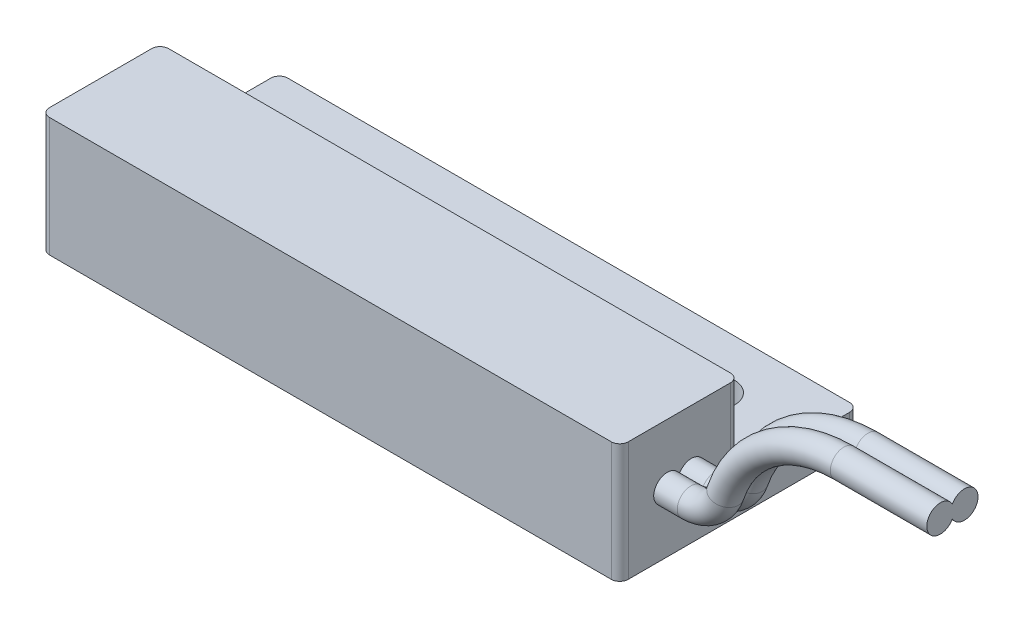
ISO-10303-21;
HEADER;
FILE_DESCRIPTION(('STEP AP214'),'2;1');
FILE_NAME('part.step','',(''),(''),'','','');
FILE_SCHEMA(('AUTOMOTIVE_DESIGN { 1 0 10303 214 1 1 1 1 }'));
ENDSEC;
DATA;
#1=APPLICATION_CONTEXT('core data for automotive mechanical design processes');
#2=APPLICATION_PROTOCOL_DEFINITION('international standard','automotive_design',2000,#1);
#3=PRODUCT_CONTEXT('',#1,'mechanical');
#4=PRODUCT('Part','Part','',(#3));
#5=PRODUCT_RELATED_PRODUCT_CATEGORY('part','',(#4));
#6=PRODUCT_DEFINITION_FORMATION('','',#4);
#7=PRODUCT_DEFINITION_CONTEXT('part definition',#1,'design');
#8=PRODUCT_DEFINITION('design','',#6,#7);
#9=PRODUCT_DEFINITION_SHAPE('','',#8);
#10=(LENGTH_UNIT() NAMED_UNIT(*) SI_UNIT(.MILLI.,.METRE.));
#11=(NAMED_UNIT(*) PLANE_ANGLE_UNIT() SI_UNIT($,.RADIAN.));
#12=(NAMED_UNIT(*) SI_UNIT($,.STERADIAN.) SOLID_ANGLE_UNIT());
#13=UNCERTAINTY_MEASURE_WITH_UNIT(LENGTH_MEASURE(1.E-05),#10,'distance_accuracy_value','');
#14=(GEOMETRIC_REPRESENTATION_CONTEXT(3) GLOBAL_UNCERTAINTY_ASSIGNED_CONTEXT((#13)) GLOBAL_UNIT_ASSIGNED_CONTEXT((#10,
#11,#12)) REPRESENTATION_CONTEXT('',''));
#15=CARTESIAN_POINT('',(0.,0.,0.));
#16=DIRECTION('',(0.,0.,1.));
#17=DIRECTION('',(1.,0.,0.));
#18=AXIS2_PLACEMENT_3D('',#15,#16,#17);
#19=CARTESIAN_POINT('',(17.,2.,-7.));
#20=DIRECTION('',(-1.,0.,0.));
#21=DIRECTION('',(0.,0.,1.));
#22=AXIS2_PLACEMENT_3D('',#19,#20,#21);
#23=PLANE('',#22);
#24=CARTESIAN_POINT('',(17.,3.5,4.20673758696571));
#25=DIRECTION('',(1.,0.,0.));
#26=DIRECTION('',(0.,0.,-1.));
#27=AXIS2_PLACEMENT_3D('',#24,#25,#26);
#28=CIRCLE('',#27,0.8);
#29=CARTESIAN_POINT('',(17.,3.87486261906181,3.5));
#30=VERTEX_POINT('',#29);
#31=CARTESIAN_POINT('',(17.,3.12513738093819,3.5));
#32=VERTEX_POINT('',#31);
#33=EDGE_CURVE('E156',#30,#32,#28,.T.);
#34=ORIENTED_EDGE('',*,*,#33,.F.);
#35=CARTESIAN_POINT('',(17.,3.5,2.79326241303428));
#36=DIRECTION('',(1.,0.,0.));
#37=DIRECTION('',(0.,0.,-1.));
#38=AXIS2_PLACEMENT_3D('',#35,#36,#37);
#39=CIRCLE('',#38,0.8);
#40=EDGE_CURVE('E162',#32,#30,#39,.T.);
#41=ORIENTED_EDGE('',*,*,#40,.F.);
#42=EDGE_LOOP('',(#34,#41));
#43=FACE_BOUND('',#42,.T.);
#44=DIRECTION('',(0.,0.,-1.));
#45=VECTOR('',#44,1.);
#46=CARTESIAN_POINT('',(17.,2.,-7.));
#47=LINE('',#46,#45);
#48=CARTESIAN_POINT('',(17.,2.,0.499999999999999));
#49=VERTEX_POINT('',#48);
#50=CARTESIAN_POINT('',(17.,2.,-6.5));
#51=VERTEX_POINT('',#50);
#52=EDGE_CURVE('E240',#49,#51,#47,.T.);
#53=ORIENTED_EDGE('',*,*,#52,.F.);
#54=DIRECTION('',(0.,-1.,0.));
#55=VECTOR('',#54,1.);
#56=CARTESIAN_POINT('',(17.,2.,0.499999999999999));
#57=LINE('',#56,#55);
#58=CARTESIAN_POINT('',(17.,7.,0.499999999999999));
#59=VERTEX_POINT('',#58);
#60=EDGE_CURVE('E267',#49,#59,#57,.F.);
#61=ORIENTED_EDGE('',*,*,#60,.T.);
#62=DIRECTION('',(0.,0.,-1.));
#63=VECTOR('',#62,1.);
#64=CARTESIAN_POINT('',(17.,7.,7.));
#65=LINE('',#64,#63);
#66=CARTESIAN_POINT('',(17.,7.,6.5));
#67=VERTEX_POINT('',#66);
#68=EDGE_CURVE('E225',#67,#59,#65,.T.);
#69=ORIENTED_EDGE('',*,*,#68,.F.);
#70=DIRECTION('',(0.,-1.,0.));
#71=VECTOR('',#70,1.);
#72=CARTESIAN_POINT('',(17.,2.,6.5));
#73=LINE('',#72,#71);
#74=CARTESIAN_POINT('',(17.,0.,6.5));
#75=VERTEX_POINT('',#74);
#76=EDGE_CURVE('E262',#67,#75,#73,.T.);
#77=ORIENTED_EDGE('',*,*,#76,.T.);
#78=DIRECTION('',(0.,0.,-1.));
#79=VECTOR('',#78,1.);
#80=CARTESIAN_POINT('',(17.,0.,-7.));
#81=LINE('',#80,#79);
#82=CARTESIAN_POINT('',(17.,0.,-6.5));
#83=VERTEX_POINT('',#82);
#84=EDGE_CURVE('E237',#75,#83,#81,.T.);
#85=ORIENTED_EDGE('',*,*,#84,.T.);
#86=DIRECTION('',(0.,-1.,0.));
#87=VECTOR('',#86,1.);
#88=CARTESIAN_POINT('',(17.,2.,-6.5));
#89=LINE('',#88,#87);
#90=EDGE_CURVE('E265',#83,#51,#89,.F.);
#91=ORIENTED_EDGE('',*,*,#90,.T.);
#92=EDGE_LOOP('',(#53,#61,#69,#77,#85,#91));
#93=FACE_BOUND('',#92,.T.);
#94=ADVANCED_FACE('F36',(#43,#93),#23,.F.);
#95=CARTESIAN_POINT('',(-17.,2.,-7.));
#96=DIRECTION('',(0.,0.,1.));
#97=DIRECTION('',(1.,0.,0.));
#98=AXIS2_PLACEMENT_3D('',#95,#96,#97);
#99=PLANE('',#98);
#100=DIRECTION('',(-1.,0.,0.));
#101=VECTOR('',#100,1.);
#102=CARTESIAN_POINT('',(-17.,0.,-7.));
#103=LINE('',#102,#101);
#104=CARTESIAN_POINT('',(16.5,0.,-7.));
#105=VERTEX_POINT('',#104);
#106=CARTESIAN_POINT('',(-16.5,0.,-7.));
#107=VERTEX_POINT('',#106);
#108=EDGE_CURVE('E251',#105,#107,#103,.T.);
#109=ORIENTED_EDGE('',*,*,#108,.T.);
#110=DIRECTION('',(0.,-1.,0.));
#111=VECTOR('',#110,1.);
#112=CARTESIAN_POINT('',(-16.5,2.,-7.));
#113=LINE('',#112,#111);
#114=CARTESIAN_POINT('',(-16.5,2.,-7.));
#115=VERTEX_POINT('',#114);
#116=EDGE_CURVE('E59',#107,#115,#113,.F.);
#117=ORIENTED_EDGE('',*,*,#116,.T.);
#118=DIRECTION('',(-1.,0.,0.));
#119=VECTOR('',#118,1.);
#120=CARTESIAN_POINT('',(-17.,2.,-7.));
#121=LINE('',#120,#119);
#122=CARTESIAN_POINT('',(16.5,2.,-7.));
#123=VERTEX_POINT('',#122);
#124=EDGE_CURVE('E243',#123,#115,#121,.T.);
#125=ORIENTED_EDGE('',*,*,#124,.F.);
#126=DIRECTION('',(0.,-1.,0.));
#127=VECTOR('',#126,1.);
#128=CARTESIAN_POINT('',(16.5,2.,-7.));
#129=LINE('',#128,#127);
#130=EDGE_CURVE('E298',#123,#105,#129,.T.);
#131=ORIENTED_EDGE('',*,*,#130,.T.);
#132=EDGE_LOOP('',(#109,#117,#125,#131));
#133=FACE_BOUND('',#132,.T.);
#134=ADVANCED_FACE('F333',(#133),#99,.F.);
#135=CARTESIAN_POINT('',(-17.,2.,-7.));
#136=DIRECTION('',(1.,0.,0.));
#137=DIRECTION('',(0.,0.,-1.));
#138=AXIS2_PLACEMENT_3D('',#135,#136,#137);
#139=PLANE('',#138);
#140=DIRECTION('',(0.,0.,1.));
#141=VECTOR('',#140,1.);
#142=CARTESIAN_POINT('',(-17.,7.,7.));
#143=LINE('',#142,#141);
#144=CARTESIAN_POINT('',(-17.,7.,0.499999999999999));
#145=VERTEX_POINT('',#144);
#146=CARTESIAN_POINT('',(-17.,7.,6.5));
#147=VERTEX_POINT('',#146);
#148=EDGE_CURVE('E231',#145,#147,#143,.T.);
#149=ORIENTED_EDGE('',*,*,#148,.F.);
#150=DIRECTION('',(0.,-1.,0.));
#151=VECTOR('',#150,1.);
#152=CARTESIAN_POINT('',(-17.,2.,0.499999999999999));
#153=LINE('',#152,#151);
#154=CARTESIAN_POINT('',(-17.,2.,0.499999999999999));
#155=VERTEX_POINT('',#154);
#156=EDGE_CURVE('E282',#145,#155,#153,.T.);
#157=ORIENTED_EDGE('',*,*,#156,.T.);
#158=DIRECTION('',(0.,0.,1.));
#159=VECTOR('',#158,1.);
#160=CARTESIAN_POINT('',(-17.,2.,-7.));
#161=LINE('',#160,#159);
#162=CARTESIAN_POINT('',(-17.,2.,-6.5));
#163=VERTEX_POINT('',#162);
#164=EDGE_CURVE('E246',#163,#155,#161,.T.);
#165=ORIENTED_EDGE('',*,*,#164,.F.);
#166=DIRECTION('',(0.,-1.,0.));
#167=VECTOR('',#166,1.);
#168=CARTESIAN_POINT('',(-17.,2.,-6.5));
#169=LINE('',#168,#167);
#170=CARTESIAN_POINT('',(-17.,0.,-6.5));
#171=VERTEX_POINT('',#170);
#172=EDGE_CURVE('E277',#163,#171,#169,.T.);
#173=ORIENTED_EDGE('',*,*,#172,.T.);
#174=DIRECTION('',(0.,0.,1.));
#175=VECTOR('',#174,1.);
#176=CARTESIAN_POINT('',(-17.,0.,-7.));
#177=LINE('',#176,#175);
#178=CARTESIAN_POINT('',(-17.,0.,6.5));
#179=VERTEX_POINT('',#178);
#180=EDGE_CURVE('E253',#171,#179,#177,.T.);
#181=ORIENTED_EDGE('',*,*,#180,.T.);
#182=DIRECTION('',(0.,-1.,0.));
#183=VECTOR('',#182,1.);
#184=CARTESIAN_POINT('',(-17.,2.,6.5));
#185=LINE('',#184,#183);
#186=EDGE_CURVE('E280',#179,#147,#185,.F.);
#187=ORIENTED_EDGE('',*,*,#186,.T.);
#188=EDGE_LOOP('',(#149,#157,#165,#173,#181,#187));
#189=FACE_BOUND('',#188,.T.);
#190=ADVANCED_FACE('F342',(#189),#139,.F.);
#191=CARTESIAN_POINT('',(-17.,2.,7.));
#192=DIRECTION('',(0.,0.,-1.));
#193=DIRECTION('',(-1.,0.,0.));
#194=AXIS2_PLACEMENT_3D('',#191,#192,#193);
#195=PLANE('',#194);
#196=DIRECTION('',(1.,0.,0.));
#197=VECTOR('',#196,1.);
#198=CARTESIAN_POINT('',(17.,7.,7.));
#199=LINE('',#198,#197);
#200=CARTESIAN_POINT('',(-16.5,7.,7.));
#201=VERTEX_POINT('',#200);
#202=CARTESIAN_POINT('',(16.5,7.,7.));
#203=VERTEX_POINT('',#202);
#204=EDGE_CURVE('E234',#201,#203,#199,.T.);
#205=ORIENTED_EDGE('',*,*,#204,.F.);
#206=DIRECTION('',(0.,-1.,0.));
#207=VECTOR('',#206,1.);
#208=CARTESIAN_POINT('',(-16.5,2.,7.));
#209=LINE('',#208,#207);
#210=CARTESIAN_POINT('',(-16.5,0.,7.));
#211=VERTEX_POINT('',#210);
#212=EDGE_CURVE('E287',#201,#211,#209,.T.);
#213=ORIENTED_EDGE('',*,*,#212,.T.);
#214=DIRECTION('',(1.,0.,0.));
#215=VECTOR('',#214,1.);
#216=CARTESIAN_POINT('',(-17.,0.,7.));
#217=LINE('',#216,#215);
#218=CARTESIAN_POINT('',(16.5,0.,7.));
#219=VERTEX_POINT('',#218);
#220=EDGE_CURVE('E244',#211,#219,#217,.T.);
#221=ORIENTED_EDGE('',*,*,#220,.T.);
#222=DIRECTION('',(0.,-1.,0.));
#223=VECTOR('',#222,1.);
#224=CARTESIAN_POINT('',(16.5,2.,7.));
#225=LINE('',#224,#223);
#226=EDGE_CURVE('E285',#219,#203,#225,.F.);
#227=ORIENTED_EDGE('',*,*,#226,.T.);
#228=EDGE_LOOP('',(#205,#213,#221,#227));
#229=FACE_BOUND('',#228,.T.);
#230=ADVANCED_FACE('F349',(#229),#195,.F.);
#231=CARTESIAN_POINT('',(0.,2.,0.));
#232=DIRECTION('',(0.,1.,0.));
#233=DIRECTION('',(0.,0.,1.));
#234=AXIS2_PLACEMENT_3D('',#231,#232,#233);
#235=PLANE('',#234);
#236=CARTESIAN_POINT('',(12.,2.,-3.5));
#237=DIRECTION('',(0.,1.,0.));
#238=DIRECTION('',(0.,0.,1.));
#239=AXIS2_PLACEMENT_3D('',#236,#237,#238);
#240=CIRCLE('',#239,1.25);
#241=CARTESIAN_POINT('',(12.,2.,-2.25));
#242=VERTEX_POINT('',#241);
#243=EDGE_CURVE('E213',#242,#242,#240,.T.);
#244=ORIENTED_EDGE('',*,*,#243,.F.);
#245=EDGE_LOOP('',(#244));
#246=FACE_BOUND('',#245,.T.);
#247=CARTESIAN_POINT('',(-12.,2.,-3.5));
#248=DIRECTION('',(0.,1.,0.));
#249=DIRECTION('',(0.,0.,-1.));
#250=AXIS2_PLACEMENT_3D('',#247,#248,#249);
#251=CIRCLE('',#250,1.25);
#252=CARTESIAN_POINT('',(-12.,2.,-4.75));
#253=VERTEX_POINT('',#252);
#254=EDGE_CURVE('E212',#253,#253,#251,.T.);
#255=ORIENTED_EDGE('',*,*,#254,.F.);
#256=EDGE_LOOP('',(#255));
#257=FACE_BOUND('',#256,.T.);
#258=ORIENTED_EDGE('',*,*,#124,.T.);
#259=CARTESIAN_POINT('',(-16.5,2.,-6.5));
#260=DIRECTION('',(0.,1.,0.));
#261=DIRECTION('',(0.,0.,1.));
#262=AXIS2_PLACEMENT_3D('',#259,#260,#261);
#263=CIRCLE('',#262,0.5);
#264=EDGE_CURVE('E304',#115,#163,#263,.T.);
#265=ORIENTED_EDGE('',*,*,#264,.T.);
#266=ORIENTED_EDGE('',*,*,#164,.T.);
#267=CARTESIAN_POINT('',(-16.5,2.,0.499999999999999));
#268=DIRECTION('',(0.,1.,0.));
#269=DIRECTION('',(0.,0.,1.));
#270=AXIS2_PLACEMENT_3D('',#267,#268,#269);
#271=CIRCLE('',#270,0.5);
#272=CARTESIAN_POINT('',(-16.5,2.,0.));
#273=VERTEX_POINT('',#272);
#274=EDGE_CURVE('E11',#155,#273,#271,.F.);
#275=ORIENTED_EDGE('',*,*,#274,.T.);
#276=DIRECTION('',(-1.,0.,0.));
#277=VECTOR('',#276,1.);
#278=CARTESIAN_POINT('',(17.,2.,0.));
#279=LINE('',#278,#277);
#280=CARTESIAN_POINT('',(16.5,2.,0.));
#281=VERTEX_POINT('',#280);
#282=EDGE_CURVE('E220',#281,#273,#279,.T.);
#283=ORIENTED_EDGE('',*,*,#282,.F.);
#284=CARTESIAN_POINT('',(16.5,2.,0.499999999999999));
#285=DIRECTION('',(0.,1.,0.));
#286=DIRECTION('',(0.,0.,1.));
#287=AXIS2_PLACEMENT_3D('',#284,#285,#286);
#288=CIRCLE('',#287,0.5);
#289=EDGE_CURVE('E44',#281,#49,#288,.F.);
#290=ORIENTED_EDGE('',*,*,#289,.T.);
#291=ORIENTED_EDGE('',*,*,#52,.T.);
#292=CARTESIAN_POINT('',(16.5,2.,-6.5));
#293=DIRECTION('',(0.,1.,0.));
#294=DIRECTION('',(0.,0.,1.));
#295=AXIS2_PLACEMENT_3D('',#292,#293,#294);
#296=CIRCLE('',#295,0.5);
#297=EDGE_CURVE('E302',#51,#123,#296,.T.);
#298=ORIENTED_EDGE('',*,*,#297,.T.);
#299=EDGE_LOOP('',(#258,#265,#266,#275,#283,#290,#291,#298));
#300=FACE_BOUND('',#299,.T.);
#301=ADVANCED_FACE('F309',(#246,#257,#300),#235,.T.);
#302=CARTESIAN_POINT('',(0.,0.,0.));
#303=DIRECTION('',(0.,1.,0.));
#304=DIRECTION('',(0.,0.,1.));
#305=AXIS2_PLACEMENT_3D('',#302,#303,#304);
#306=PLANE('',#305);
#307=CARTESIAN_POINT('',(12.,0.,-3.5));
#308=DIRECTION('',(0.,1.,0.));
#309=DIRECTION('',(0.,0.,1.));
#310=AXIS2_PLACEMENT_3D('',#307,#308,#309);
#311=CIRCLE('',#310,1.25);
#312=CARTESIAN_POINT('',(12.,0.,-2.25));
#313=VERTEX_POINT('',#312);
#314=EDGE_CURVE('E216',#313,#313,#311,.F.);
#315=ORIENTED_EDGE('',*,*,#314,.F.);
#316=EDGE_LOOP('',(#315));
#317=FACE_BOUND('',#316,.T.);
#318=CARTESIAN_POINT('',(-12.,0.,-3.5));
#319=DIRECTION('',(0.,1.,0.));
#320=DIRECTION('',(0.,0.,1.));
#321=AXIS2_PLACEMENT_3D('',#318,#319,#320);
#322=CIRCLE('',#321,1.25);
#323=CARTESIAN_POINT('',(-12.,0.,-2.25));
#324=VERTEX_POINT('',#323);
#325=EDGE_CURVE('E217',#324,#324,#322,.F.);
#326=ORIENTED_EDGE('',*,*,#325,.F.);
#327=EDGE_LOOP('',(#326));
#328=FACE_BOUND('',#327,.T.);
#329=ORIENTED_EDGE('',*,*,#220,.F.);
#330=CARTESIAN_POINT('',(-16.5,0.,6.5));
#331=DIRECTION('',(0.,1.,0.));
#332=DIRECTION('',(0.,0.,1.));
#333=AXIS2_PLACEMENT_3D('',#330,#331,#332);
#334=CIRCLE('',#333,0.5);
#335=EDGE_CURVE('E296',#211,#179,#334,.F.);
#336=ORIENTED_EDGE('',*,*,#335,.T.);
#337=ORIENTED_EDGE('',*,*,#180,.F.);
#338=CARTESIAN_POINT('',(-16.5,0.,-6.5));
#339=DIRECTION('',(0.,1.,0.));
#340=DIRECTION('',(0.,0.,1.));
#341=AXIS2_PLACEMENT_3D('',#338,#339,#340);
#342=CIRCLE('',#341,0.5);
#343=EDGE_CURVE('E294',#171,#107,#342,.F.);
#344=ORIENTED_EDGE('',*,*,#343,.T.);
#345=ORIENTED_EDGE('',*,*,#108,.F.);
#346=CARTESIAN_POINT('',(16.5,0.,-6.5));
#347=DIRECTION('',(0.,1.,0.));
#348=DIRECTION('',(0.,0.,1.));
#349=AXIS2_PLACEMENT_3D('',#346,#347,#348);
#350=CIRCLE('',#349,0.5);
#351=EDGE_CURVE('E292',#105,#83,#350,.F.);
#352=ORIENTED_EDGE('',*,*,#351,.T.);
#353=ORIENTED_EDGE('',*,*,#84,.F.);
#354=CARTESIAN_POINT('',(16.5,0.,6.5));
#355=DIRECTION('',(0.,1.,0.));
#356=DIRECTION('',(0.,0.,1.));
#357=AXIS2_PLACEMENT_3D('',#354,#355,#356);
#358=CIRCLE('',#357,0.5);
#359=EDGE_CURVE('E290',#75,#219,#358,.F.);
#360=ORIENTED_EDGE('',*,*,#359,.T.);
#361=EDGE_LOOP('',(#329,#336,#337,#344,#345,#352,#353,#360));
#362=FACE_BOUND('',#361,.T.);
#363=ADVANCED_FACE('F328',(#317,#328,#362),#306,.F.);
#364=CARTESIAN_POINT('',(17.,7.,0.));
#365=DIRECTION('',(0.,0.,1.));
#366=DIRECTION('',(1.,0.,0.));
#367=AXIS2_PLACEMENT_3D('',#364,#365,#366);
#368=PLANE('',#367);
#369=DIRECTION('',(-1.,0.,0.));
#370=VECTOR('',#369,1.);
#371=CARTESIAN_POINT('',(17.,7.,0.));
#372=LINE('',#371,#370);
#373=CARTESIAN_POINT('',(16.5,7.,0.));
#374=VERTEX_POINT('',#373);
#375=CARTESIAN_POINT('',(-16.5,7.,0.));
#376=VERTEX_POINT('',#375);
#377=EDGE_CURVE('E228',#374,#376,#372,.T.);
#378=ORIENTED_EDGE('',*,*,#377,.F.);
#379=DIRECTION('',(0.,-1.,0.));
#380=VECTOR('',#379,1.);
#381=CARTESIAN_POINT('',(16.5,7.,0.));
#382=LINE('',#381,#380);
#383=EDGE_CURVE('E259',#374,#281,#382,.T.);
#384=ORIENTED_EDGE('',*,*,#383,.T.);
#385=ORIENTED_EDGE('',*,*,#282,.T.);
#386=DIRECTION('',(0.,-1.,0.));
#387=VECTOR('',#386,1.);
#388=CARTESIAN_POINT('',(-16.5,7.,0.));
#389=LINE('',#388,#387);
#390=EDGE_CURVE('E248',#273,#376,#389,.F.);
#391=ORIENTED_EDGE('',*,*,#390,.T.);
#392=EDGE_LOOP('',(#378,#384,#385,#391));
#393=FACE_BOUND('',#392,.T.);
#394=ADVANCED_FACE('F399',(#393),#368,.F.);
#395=CARTESIAN_POINT('',(0.,7.,0.));
#396=DIRECTION('',(0.,1.,0.));
#397=DIRECTION('',(0.,0.,1.));
#398=AXIS2_PLACEMENT_3D('',#395,#396,#397);
#399=PLANE('',#398);
#400=ORIENTED_EDGE('',*,*,#68,.T.);
#401=CARTESIAN_POINT('',(16.5,7.,0.499999999999999));
#402=DIRECTION('',(0.,1.,0.));
#403=DIRECTION('',(0.,0.,1.));
#404=AXIS2_PLACEMENT_3D('',#401,#402,#403);
#405=CIRCLE('',#404,0.5);
#406=EDGE_CURVE('E275',#59,#374,#405,.T.);
#407=ORIENTED_EDGE('',*,*,#406,.T.);
#408=ORIENTED_EDGE('',*,*,#377,.T.);
#409=CARTESIAN_POINT('',(-16.5,7.,0.499999999999999));
#410=DIRECTION('',(0.,1.,0.));
#411=DIRECTION('',(0.,0.,1.));
#412=AXIS2_PLACEMENT_3D('',#409,#410,#411);
#413=CIRCLE('',#412,0.5);
#414=EDGE_CURVE('E273',#376,#145,#413,.T.);
#415=ORIENTED_EDGE('',*,*,#414,.T.);
#416=ORIENTED_EDGE('',*,*,#148,.T.);
#417=CARTESIAN_POINT('',(-16.5,7.,6.5));
#418=DIRECTION('',(0.,1.,0.));
#419=DIRECTION('',(0.,0.,1.));
#420=AXIS2_PLACEMENT_3D('',#417,#418,#419);
#421=CIRCLE('',#420,0.5);
#422=EDGE_CURVE('E271',#147,#201,#421,.T.);
#423=ORIENTED_EDGE('',*,*,#422,.T.);
#424=ORIENTED_EDGE('',*,*,#204,.T.);
#425=CARTESIAN_POINT('',(16.5,7.,6.5));
#426=DIRECTION('',(0.,1.,0.));
#427=DIRECTION('',(0.,0.,1.));
#428=AXIS2_PLACEMENT_3D('',#425,#426,#427);
#429=CIRCLE('',#428,0.5);
#430=EDGE_CURVE('E269',#203,#67,#429,.T.);
#431=ORIENTED_EDGE('',*,*,#430,.T.);
#432=EDGE_LOOP('',(#400,#407,#408,#415,#416,#423,#424,#431));
#433=FACE_BOUND('',#432,.T.);
#434=ADVANCED_FACE('F318',(#433),#399,.T.);
#435=CARTESIAN_POINT('',(16.5,7.,0.499999999999999));
#436=DIRECTION('',(0.,-1.,0.));
#437=DIRECTION('',(0.,0.,-1.));
#438=AXIS2_PLACEMENT_3D('',#435,#436,#437);
#439=CYLINDRICAL_SURFACE('',#438,0.5);
#440=ORIENTED_EDGE('',*,*,#406,.F.);
#441=ORIENTED_EDGE('',*,*,#60,.F.);
#442=ORIENTED_EDGE('',*,*,#289,.F.);
#443=ORIENTED_EDGE('',*,*,#383,.F.);
#444=EDGE_LOOP('',(#440,#441,#442,#443));
#445=FACE_BOUND('',#444,.T.);
#446=ADVANCED_FACE('F314',(#445),#439,.T.);
#447=CARTESIAN_POINT('',(-16.5,2.,0.499999999999999));
#448=DIRECTION('',(0.,-1.,0.));
#449=DIRECTION('',(0.,0.,-1.));
#450=AXIS2_PLACEMENT_3D('',#447,#448,#449);
#451=CYLINDRICAL_SURFACE('',#450,0.5);
#452=ORIENTED_EDGE('',*,*,#414,.F.);
#453=ORIENTED_EDGE('',*,*,#390,.F.);
#454=ORIENTED_EDGE('',*,*,#274,.F.);
#455=ORIENTED_EDGE('',*,*,#156,.F.);
#456=EDGE_LOOP('',(#452,#453,#454,#455));
#457=FACE_BOUND('',#456,.T.);
#458=ADVANCED_FACE('F369',(#457),#451,.T.);
#459=CARTESIAN_POINT('',(-16.5,2.,6.5));
#460=DIRECTION('',(0.,-1.,0.));
#461=DIRECTION('',(0.,0.,-1.));
#462=AXIS2_PLACEMENT_3D('',#459,#460,#461);
#463=CYLINDRICAL_SURFACE('',#462,0.5);
#464=ORIENTED_EDGE('',*,*,#422,.F.);
#465=ORIENTED_EDGE('',*,*,#186,.F.);
#466=ORIENTED_EDGE('',*,*,#335,.F.);
#467=ORIENTED_EDGE('',*,*,#212,.F.);
#468=EDGE_LOOP('',(#464,#465,#466,#467));
#469=FACE_BOUND('',#468,.T.);
#470=ADVANCED_FACE('F347',(#469),#463,.T.);
#471=CARTESIAN_POINT('',(-16.5,2.,-6.5));
#472=DIRECTION('',(0.,-1.,0.));
#473=DIRECTION('',(0.,0.,-1.));
#474=AXIS2_PLACEMENT_3D('',#471,#472,#473);
#475=CYLINDRICAL_SURFACE('',#474,0.5);
#476=ORIENTED_EDGE('',*,*,#264,.F.);
#477=ORIENTED_EDGE('',*,*,#116,.F.);
#478=ORIENTED_EDGE('',*,*,#343,.F.);
#479=ORIENTED_EDGE('',*,*,#172,.F.);
#480=EDGE_LOOP('',(#476,#477,#478,#479));
#481=FACE_BOUND('',#480,.T.);
#482=ADVANCED_FACE('F338',(#481),#475,.T.);
#483=CARTESIAN_POINT('',(16.5,2.,-6.5));
#484=DIRECTION('',(0.,-1.,0.));
#485=DIRECTION('',(0.,0.,-1.));
#486=AXIS2_PLACEMENT_3D('',#483,#484,#485);
#487=CYLINDRICAL_SURFACE('',#486,0.5);
#488=ORIENTED_EDGE('',*,*,#297,.F.);
#489=ORIENTED_EDGE('',*,*,#90,.F.);
#490=ORIENTED_EDGE('',*,*,#351,.F.);
#491=ORIENTED_EDGE('',*,*,#130,.F.);
#492=EDGE_LOOP('',(#488,#489,#490,#491));
#493=FACE_BOUND('',#492,.T.);
#494=ADVANCED_FACE('F332',(#493),#487,.T.);
#495=CARTESIAN_POINT('',(16.5,2.,6.5));
#496=DIRECTION('',(0.,-1.,0.));
#497=DIRECTION('',(0.,0.,-1.));
#498=AXIS2_PLACEMENT_3D('',#495,#496,#497);
#499=CYLINDRICAL_SURFACE('',#498,0.5);
#500=ORIENTED_EDGE('',*,*,#430,.F.);
#501=ORIENTED_EDGE('',*,*,#226,.F.);
#502=ORIENTED_EDGE('',*,*,#359,.F.);
#503=ORIENTED_EDGE('',*,*,#76,.F.);
#504=EDGE_LOOP('',(#500,#501,#502,#503));
#505=FACE_BOUND('',#504,.T.);
#506=ADVANCED_FACE('F38',(#505),#499,.T.);
#507=CARTESIAN_POINT('',(-12.,-0.00100000000000013,-3.5));
#508=DIRECTION('',(0.,1.,0.));
#509=DIRECTION('',(0.,0.,1.));
#510=AXIS2_PLACEMENT_3D('',#507,#508,#509);
#511=CYLINDRICAL_SURFACE('',#510,1.25);
#512=ORIENTED_EDGE('',*,*,#254,.T.);
#513=EDGE_LOOP('',(#512));
#514=FACE_BOUND('',#513,.T.);
#515=ORIENTED_EDGE('',*,*,#325,.T.);
#516=EDGE_LOOP('',(#515));
#517=FACE_BOUND('',#516,.T.);
#518=ADVANCED_FACE('F380',(#514,#517),#511,.F.);
#519=CARTESIAN_POINT('',(12.,-0.00100000000000013,-3.5));
#520=DIRECTION('',(0.,1.,0.));
#521=DIRECTION('',(0.,0.,1.));
#522=AXIS2_PLACEMENT_3D('',#519,#520,#521);
#523=CYLINDRICAL_SURFACE('',#522,1.25);
#524=ORIENTED_EDGE('',*,*,#243,.T.);
#525=EDGE_LOOP('',(#524));
#526=FACE_BOUND('',#525,.T.);
#527=ORIENTED_EDGE('',*,*,#314,.T.);
#528=EDGE_LOOP('',(#527));
#529=FACE_BOUND('',#528,.T.);
#530=ADVANCED_FACE('F384',(#526,#529),#523,.F.);
#531=CARTESIAN_POINT('',(33.038157500681,9.97180162472532,3.5));
#532=DIRECTION('',(1.,0.,0.));
#533=DIRECTION('',(0.,0.,-1.));
#534=AXIS2_PLACEMENT_3D('',#531,#532,#533);
#535=PLANE('',#534);
#536=CARTESIAN_POINT('',(33.038157500681,9.97180162472532,2.79326241303428));
#537=DIRECTION('',(1.,0.,0.));
#538=DIRECTION('',(0.,0.,-1.));
#539=AXIS2_PLACEMENT_3D('',#536,#537,#538);
#540=CIRCLE('',#539,0.8);
#541=CARTESIAN_POINT('',(33.038157500681,9.59693900566351,3.5));
#542=VERTEX_POINT('',#541);
#543=CARTESIAN_POINT('',(33.038157500681,10.3466642437871,3.5));
#544=VERTEX_POINT('',#543);
#545=EDGE_CURVE('E196',#542,#544,#540,.T.);
#546=ORIENTED_EDGE('',*,*,#545,.T.);
#547=CARTESIAN_POINT('',(33.038157500681,9.97180162472532,4.20673758696571));
#548=DIRECTION('',(1.,0.,0.));
#549=DIRECTION('',(0.,0.,-1.));
#550=AXIS2_PLACEMENT_3D('',#547,#548,#549);
#551=CIRCLE('',#550,0.8);
#552=EDGE_CURVE('E202',#544,#542,#551,.T.);
#553=ORIENTED_EDGE('',*,*,#552,.T.);
#554=EDGE_LOOP('',(#546,#553));
#555=FACE_BOUND('',#554,.T.);
#556=ADVANCED_FACE('F390',(#555),#535,.T.);
#557=CARTESIAN_POINT('',(17.,3.5,2.79326241303428));
#558=DIRECTION('',(1.,0.,0.));
#559=DIRECTION('',(0.,0.,-1.));
#560=AXIS2_PLACEMENT_3D('',#557,#558,#559);
#561=CYLINDRICAL_SURFACE('',#560,0.8);
#562=DIRECTION('',(1.,0.,0.));
#563=VECTOR('',#562,1.);
#564=CARTESIAN_POINT('',(17.,3.87486261906181,3.5));
#565=LINE('',#564,#563);
#566=CARTESIAN_POINT('',(18.3825780077455,3.87486261906181,3.5));
#567=VERTEX_POINT('',#566);
#568=EDGE_CURVE('E51',#30,#567,#565,.T.);
#569=ORIENTED_EDGE('',*,*,#568,.T.);
#570=CARTESIAN_POINT('',(18.3825780077455,3.5,2.79326241303428));
#571=DIRECTION('',(1.,0.,0.));
#572=DIRECTION('',(0.,0.,-1.));
#573=AXIS2_PLACEMENT_3D('',#570,#571,#572);
#574=CIRCLE('',#573,0.8);
#575=CARTESIAN_POINT('',(18.3825780077455,3.12513738093819,3.5));
#576=VERTEX_POINT('',#575);
#577=EDGE_CURVE('E168',#576,#567,#574,.T.);
#578=ORIENTED_EDGE('',*,*,#577,.F.);
#579=DIRECTION('',(1.,0.,0.));
#580=VECTOR('',#579,1.);
#581=CARTESIAN_POINT('',(17.,3.12513738093819,3.5));
#582=LINE('',#581,#580);
#583=EDGE_CURVE('E159',#32,#576,#582,.T.);
#584=ORIENTED_EDGE('',*,*,#583,.F.);
#585=ORIENTED_EDGE('',*,*,#40,.T.);
#586=EDGE_LOOP('',(#569,#578,#584,#585));
#587=FACE_BOUND('',#586,.T.);
#588=ADVANCED_FACE('F166',(#587),#561,.T.);
#589=CARTESIAN_POINT('',(17.,3.5,4.20673758696571));
#590=DIRECTION('',(1.,0.,0.));
#591=DIRECTION('',(0.,0.,-1.));
#592=AXIS2_PLACEMENT_3D('',#589,#590,#591);
#593=CYLINDRICAL_SURFACE('',#592,0.8);
#594=CARTESIAN_POINT('',(18.3825780077455,3.5,4.20673758696571));
#595=DIRECTION('',(1.,0.,0.));
#596=DIRECTION('',(0.,0.,-1.));
#597=AXIS2_PLACEMENT_3D('',#594,#595,#596);
#598=CIRCLE('',#597,0.8);
#599=EDGE_CURVE('E174',#567,#576,#598,.T.);
#600=ORIENTED_EDGE('',*,*,#599,.F.);
#601=ORIENTED_EDGE('',*,*,#568,.F.);
#602=ORIENTED_EDGE('',*,*,#33,.T.);
#603=ORIENTED_EDGE('',*,*,#583,.T.);
#604=EDGE_LOOP('',(#600,#601,#602,#603));
#605=FACE_BOUND('',#604,.T.);
#606=ADVANCED_FACE('F158',(#605),#593,.T.);
#607=CARTESIAN_POINT('',(18.3825780077455,5.64463583234627,2.79326241303428));
#608=DIRECTION('',(0.,0.,1.));
#609=DIRECTION('',(1.,0.,0.));
#610=AXIS2_PLACEMENT_3D('',#607,#608,#609);
#611=TOROIDAL_SURFACE('',#610,2.14463583234627,0.8);
#612=CARTESIAN_POINT('',(18.3825780077455,5.64463583234627,3.5));
#613=DIRECTION('',(0.,0.,1.));
#614=DIRECTION('',(0.,-1.,0.));
#615=AXIS2_PLACEMENT_3D('',#612,#613,#614);
#616=CIRCLE('',#615,1.76977321328446);
#617=CARTESIAN_POINT('',(20.0608292382277,5.08287962735688,3.5));
#618=VERTEX_POINT('',#617);
#619=EDGE_CURVE('E179',#567,#618,#616,.T.);
#620=ORIENTED_EDGE('',*,*,#619,.T.);
#621=CARTESIAN_POINT('',(20.4163062264542,4.96389183801988,2.79326241303428));
#622=DIRECTION('',(0.317417057040234,0.948286039072556,0.));
#623=DIRECTION('',(0.,0.,-1.));
#624=AXIS2_PLACEMENT_3D('',#621,#622,#623);
#625=CIRCLE('',#624,0.8);
#626=CARTESIAN_POINT('',(20.7717832146807,4.84490404868289,3.5));
#627=VERTEX_POINT('',#626);
#628=EDGE_CURVE('E176',#627,#618,#625,.T.);
#629=ORIENTED_EDGE('',*,*,#628,.F.);
#630=CARTESIAN_POINT('',(18.3825780077455,5.64463583234627,3.5));
#631=DIRECTION('',(0.,0.,1.));
#632=DIRECTION('',(0.,-1.,0.));
#633=AXIS2_PLACEMENT_3D('',#630,#631,#632);
#634=CIRCLE('',#633,2.51949845140807);
#635=EDGE_CURVE('E180',#576,#627,#634,.T.);
#636=ORIENTED_EDGE('',*,*,#635,.F.);
#637=ORIENTED_EDGE('',*,*,#577,.T.);
#638=EDGE_LOOP('',(#620,#629,#636,#637));
#639=FACE_BOUND('',#638,.T.);
#640=ADVANCED_FACE('F518',(#639),#611,.T.);
#641=CARTESIAN_POINT('',(18.3825780077455,5.64463583234627,4.20673758696571));
#642=DIRECTION('',(0.,0.,1.));
#643=DIRECTION('',(1.,0.,0.));
#644=AXIS2_PLACEMENT_3D('',#641,#642,#643);
#645=TOROIDAL_SURFACE('',#644,2.14463583234627,0.8);
#646=CARTESIAN_POINT('',(20.4163062264542,4.96389183801988,4.20673758696571));
#647=DIRECTION('',(0.317417057040234,0.948286039072556,0.));
#648=DIRECTION('',(0.,0.,-1.));
#649=AXIS2_PLACEMENT_3D('',#646,#647,#648);
#650=CIRCLE('',#649,0.8);
#651=EDGE_CURVE('E183',#618,#627,#650,.T.);
#652=ORIENTED_EDGE('',*,*,#651,.F.);
#653=ORIENTED_EDGE('',*,*,#619,.F.);
#654=ORIENTED_EDGE('',*,*,#599,.T.);
#655=ORIENTED_EDGE('',*,*,#635,.T.);
#656=EDGE_LOOP('',(#652,#653,#654,#655));
#657=FACE_BOUND('',#656,.T.);
#658=ADVANCED_FACE('F527',(#657),#645,.T.);
#659=CARTESIAN_POINT('',(27.3736012843641,2.63509648382258,2.79326241303428));
#660=DIRECTION('',(0.,0.,-1.));
#661=DIRECTION('',(-1.,0.,0.));
#662=AXIS2_PLACEMENT_3D('',#659,#660,#661);
#663=TOROIDAL_SURFACE('',#662,7.33670514090274,0.8);
#664=CARTESIAN_POINT('',(27.3736012843641,2.63509648382258,3.5));
#665=DIRECTION('',(0.,0.,-1.));
#666=DIRECTION('',(-0.948286039072556,0.317417057040234,0.));
#667=AXIS2_PLACEMENT_3D('',#664,#665,#666);
#668=CIRCLE('',#667,7.71156775996455);
#669=CARTESIAN_POINT('',(27.3736012843641,10.3466642437871,3.5));
#670=VERTEX_POINT('',#669);
#671=EDGE_CURVE('E189',#618,#670,#668,.T.);
#672=ORIENTED_EDGE('',*,*,#671,.T.);
#673=CARTESIAN_POINT('',(27.3736012843641,9.97180162472531,2.79326241303428));
#674=DIRECTION('',(1.,0.,0.));
#675=DIRECTION('',(0.,0.,-1.));
#676=AXIS2_PLACEMENT_3D('',#673,#674,#675);
#677=CIRCLE('',#676,0.8);
#678=CARTESIAN_POINT('',(27.3736012843641,9.59693900566351,3.5));
#679=VERTEX_POINT('',#678);
#680=EDGE_CURVE('E186',#679,#670,#677,.T.);
#681=ORIENTED_EDGE('',*,*,#680,.F.);
#682=CARTESIAN_POINT('',(27.3736012843641,2.63509648382258,3.5));
#683=DIRECTION('',(0.,0.,-1.));
#684=DIRECTION('',(-0.948286039072556,0.317417057040234,0.));
#685=AXIS2_PLACEMENT_3D('',#682,#683,#684);
#686=CIRCLE('',#685,6.96184252184093);
#687=EDGE_CURVE('E190',#627,#679,#686,.T.);
#688=ORIENTED_EDGE('',*,*,#687,.F.);
#689=ORIENTED_EDGE('',*,*,#628,.T.);
#690=EDGE_LOOP('',(#672,#681,#688,#689));
#691=FACE_BOUND('',#690,.T.);
#692=ADVANCED_FACE('F537',(#691),#663,.T.);
#693=CARTESIAN_POINT('',(27.3736012843641,2.63509648382258,4.20673758696571));
#694=DIRECTION('',(0.,0.,-1.));
#695=DIRECTION('',(-1.,0.,0.));
#696=AXIS2_PLACEMENT_3D('',#693,#694,#695);
#697=TOROIDAL_SURFACE('',#696,7.33670514090274,0.8);
#698=CARTESIAN_POINT('',(27.3736012843641,9.97180162472531,4.20673758696571));
#699=DIRECTION('',(1.,0.,0.));
#700=DIRECTION('',(0.,0.,-1.));
#701=AXIS2_PLACEMENT_3D('',#698,#699,#700);
#702=CIRCLE('',#701,0.8);
#703=EDGE_CURVE('E193',#670,#679,#702,.T.);
#704=ORIENTED_EDGE('',*,*,#703,.F.);
#705=ORIENTED_EDGE('',*,*,#671,.F.);
#706=ORIENTED_EDGE('',*,*,#651,.T.);
#707=ORIENTED_EDGE('',*,*,#687,.T.);
#708=EDGE_LOOP('',(#704,#705,#706,#707));
#709=FACE_BOUND('',#708,.T.);
#710=ADVANCED_FACE('F547',(#709),#697,.T.);
#711=CARTESIAN_POINT('',(27.3736012843641,9.97180162472532,2.79326241303428));
#712=DIRECTION('',(1.,0.,0.));
#713=DIRECTION('',(0.,0.,-1.));
#714=AXIS2_PLACEMENT_3D('',#711,#712,#713);
#715=CYLINDRICAL_SURFACE('',#714,0.8);
#716=DIRECTION('',(1.,0.,0.));
#717=VECTOR('',#716,1.);
#718=CARTESIAN_POINT('',(27.3736012843641,10.3466642437871,3.5));
#719=LINE('',#718,#717);
#720=EDGE_CURVE('E198',#670,#544,#719,.T.);
#721=ORIENTED_EDGE('',*,*,#720,.T.);
#722=ORIENTED_EDGE('',*,*,#545,.F.);
#723=DIRECTION('',(1.,0.,0.));
#724=VECTOR('',#723,1.);
#725=CARTESIAN_POINT('',(27.3736012843641,9.59693900566351,3.5));
#726=LINE('',#725,#724);
#727=EDGE_CURVE('E199',#679,#542,#726,.T.);
#728=ORIENTED_EDGE('',*,*,#727,.F.);
#729=ORIENTED_EDGE('',*,*,#680,.T.);
#730=EDGE_LOOP('',(#721,#722,#728,#729));
#731=FACE_BOUND('',#730,.T.);
#732=ADVANCED_FACE('F557',(#731),#715,.T.);
#733=CARTESIAN_POINT('',(27.3736012843641,9.97180162472532,4.20673758696571));
#734=DIRECTION('',(1.,0.,0.));
#735=DIRECTION('',(0.,0.,-1.));
#736=AXIS2_PLACEMENT_3D('',#733,#734,#735);
#737=CYLINDRICAL_SURFACE('',#736,0.8);
#738=ORIENTED_EDGE('',*,*,#552,.F.);
#739=ORIENTED_EDGE('',*,*,#720,.F.);
#740=ORIENTED_EDGE('',*,*,#703,.T.);
#741=ORIENTED_EDGE('',*,*,#727,.T.);
#742=EDGE_LOOP('',(#738,#739,#740,#741));
#743=FACE_BOUND('',#742,.T.);
#744=ADVANCED_FACE('F393',(#743),#737,.T.);
#745=CLOSED_SHELL('',(#94,#134,#190,#230,#301,#363,#394,#434,#446,#458,#470,#482,#494,#506,#518,
#530,#556,#588,#606,#640,#658,#692,#710,#732,#744));
#746=MANIFOLD_SOLID_BREP('B2',#745);
#747=ADVANCED_BREP_SHAPE_REPRESENTATION('',(#18,#746),#14);
#748=SHAPE_DEFINITION_REPRESENTATION(#9,#747);
ENDSEC;
END-ISO-10303-21;
